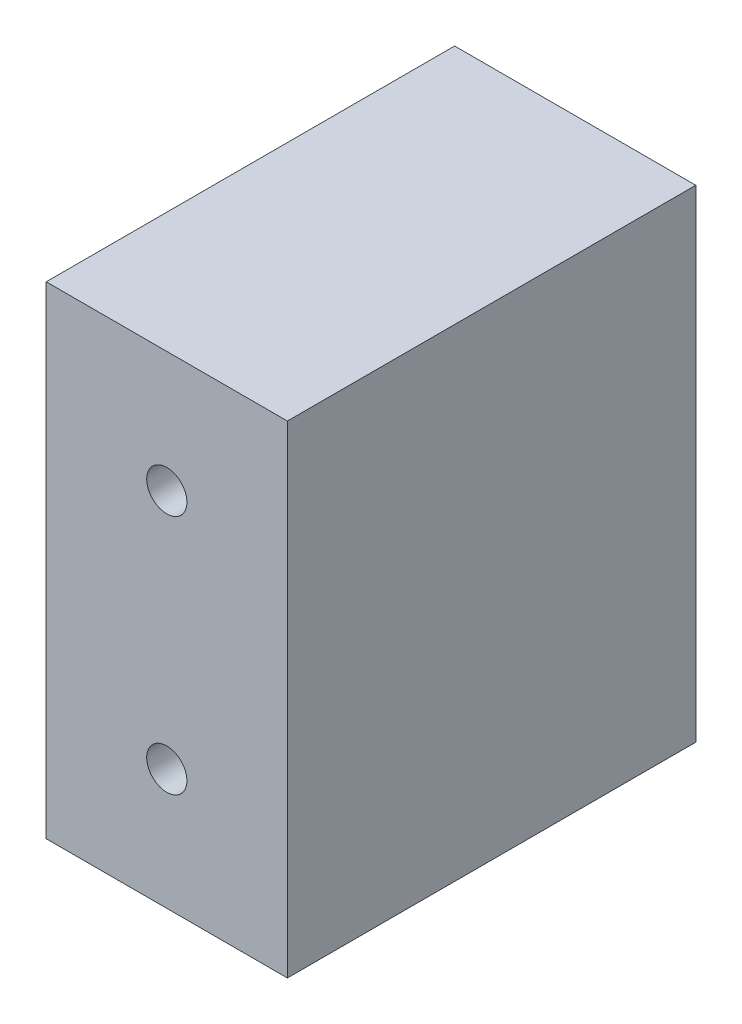
ISO-10303-21;
HEADER;
FILE_DESCRIPTION(('STEP AP214'),'2;1');
FILE_NAME('part.step','',(''),(''),'','','');
FILE_SCHEMA(('AUTOMOTIVE_DESIGN { 1 0 10303 214 1 1 1 1 }'));
ENDSEC;
DATA;
#1=APPLICATION_CONTEXT('core data for automotive mechanical design processes');
#2=APPLICATION_PROTOCOL_DEFINITION('international standard','automotive_design',2000,#1);
#3=PRODUCT_CONTEXT('',#1,'mechanical');
#4=PRODUCT('Part','Part','',(#3));
#5=PRODUCT_RELATED_PRODUCT_CATEGORY('part','',(#4));
#6=PRODUCT_DEFINITION_FORMATION('','',#4);
#7=PRODUCT_DEFINITION_CONTEXT('part definition',#1,'design');
#8=PRODUCT_DEFINITION('design','',#6,#7);
#9=PRODUCT_DEFINITION_SHAPE('','',#8);
#10=(LENGTH_UNIT() NAMED_UNIT(*) SI_UNIT(.MILLI.,.METRE.));
#11=(NAMED_UNIT(*) PLANE_ANGLE_UNIT() SI_UNIT($,.RADIAN.));
#12=(NAMED_UNIT(*) SI_UNIT($,.STERADIAN.) SOLID_ANGLE_UNIT());
#13=UNCERTAINTY_MEASURE_WITH_UNIT(LENGTH_MEASURE(1.E-05),#10,'distance_accuracy_value','');
#14=(GEOMETRIC_REPRESENTATION_CONTEXT(3) GLOBAL_UNCERTAINTY_ASSIGNED_CONTEXT((#13)) GLOBAL_UNIT_ASSIGNED_CONTEXT((#10,
#11,#12)) REPRESENTATION_CONTEXT('',''));
#15=CARTESIAN_POINT('',(0.,0.,0.));
#16=DIRECTION('',(0.,0.,1.));
#17=DIRECTION('',(1.,0.,0.));
#18=AXIS2_PLACEMENT_3D('',#15,#16,#17);
#19=CARTESIAN_POINT('',(0.,0.,25.4));
#20=DIRECTION('',(0.,0.,1.));
#21=DIRECTION('',(1.,0.,0.));
#22=AXIS2_PLACEMENT_3D('',#19,#20,#21);
#23=PLANE('',#22);
#24=CARTESIAN_POINT('',(0.88120104438642,-0.665796344647519,25.4));
#25=DIRECTION('',(0.,0.,1.));
#26=DIRECTION('',(1.,0.,0.));
#27=AXIS2_PLACEMENT_3D('',#24,#25,#26);
#28=CIRCLE('',#27,1.25);
#29=CARTESIAN_POINT('',(2.13120104438642,-0.665796344647519,25.4));
#30=VERTEX_POINT('',#29);
#31=EDGE_CURVE('E100',#30,#30,#28,.T.);
#32=ORIENTED_EDGE('',*,*,#31,.F.);
#33=EDGE_LOOP('',(#32));
#34=FACE_BOUND('',#33,.T.);
#35=DIRECTION('',(0.,-1.,0.));
#36=VECTOR('',#35,1.);
#37=CARTESIAN_POINT('',(-6.61879895561358,6.83420365535248,25.4));
#38=LINE('',#37,#36);
#39=CARTESIAN_POINT('',(-6.61879895561358,6.83420365535248,25.4));
#40=VERTEX_POINT('',#39);
#41=CARTESIAN_POINT('',(-6.61879895561358,-23.1657963446475,25.4));
#42=VERTEX_POINT('',#41);
#43=EDGE_CURVE('E85',#40,#42,#38,.T.);
#44=ORIENTED_EDGE('',*,*,#43,.T.);
#45=DIRECTION('',(1.,0.,0.));
#46=VECTOR('',#45,1.);
#47=CARTESIAN_POINT('',(-6.61879895561358,-23.1657963446475,25.4));
#48=LINE('',#47,#46);
#49=CARTESIAN_POINT('',(8.38120104438642,-23.1657963446475,25.4));
#50=VERTEX_POINT('',#49);
#51=EDGE_CURVE('E80',#42,#50,#48,.T.);
#52=ORIENTED_EDGE('',*,*,#51,.T.);
#53=DIRECTION('',(0.,1.,0.));
#54=VECTOR('',#53,1.);
#55=CARTESIAN_POINT('',(8.38120104438642,6.83420365535248,25.4));
#56=LINE('',#55,#54);
#57=CARTESIAN_POINT('',(8.38120104438642,6.83420365535248,25.4));
#58=VERTEX_POINT('',#57);
#59=EDGE_CURVE('E83',#50,#58,#56,.T.);
#60=ORIENTED_EDGE('',*,*,#59,.T.);
#61=DIRECTION('',(-1.,0.,0.));
#62=VECTOR('',#61,1.);
#63=CARTESIAN_POINT('',(-6.61879895561358,6.83420365535248,25.4));
#64=LINE('',#63,#62);
#65=EDGE_CURVE('E50',#58,#40,#64,.T.);
#66=ORIENTED_EDGE('',*,*,#65,.T.);
#67=EDGE_LOOP('',(#44,#52,#60,#66));
#68=FACE_BOUND('',#67,.T.);
#69=CARTESIAN_POINT('',(0.881201044386421,-15.6657963446475,25.4));
#70=DIRECTION('',(0.,0.,1.));
#71=DIRECTION('',(1.,0.,0.));
#72=AXIS2_PLACEMENT_3D('',#69,#70,#71);
#73=CIRCLE('',#72,1.25);
#74=CARTESIAN_POINT('',(2.13120104438642,-15.6657963446475,25.4));
#75=VERTEX_POINT('',#74);
#76=EDGE_CURVE('E115',#75,#75,#73,.T.);
#77=ORIENTED_EDGE('',*,*,#76,.F.);
#78=EDGE_LOOP('',(#77));
#79=FACE_BOUND('',#78,.T.);
#80=ADVANCED_FACE('F33',(#34,#68,#79),#23,.T.);
#81=CARTESIAN_POINT('',(0.,0.,0.));
#82=DIRECTION('',(0.,0.,1.));
#83=DIRECTION('',(1.,0.,0.));
#84=AXIS2_PLACEMENT_3D('',#81,#82,#83);
#85=PLANE('',#84);
#86=DIRECTION('',(0.,-1.,0.));
#87=VECTOR('',#86,1.);
#88=CARTESIAN_POINT('',(-6.61879895561358,6.83420365535248,0.));
#89=LINE('',#88,#87);
#90=CARTESIAN_POINT('',(-6.61879895561358,6.83420365535248,0.));
#91=VERTEX_POINT('',#90);
#92=CARTESIAN_POINT('',(-6.61879895561358,-23.1657963446475,0.));
#93=VERTEX_POINT('',#92);
#94=EDGE_CURVE('E97',#91,#93,#89,.T.);
#95=ORIENTED_EDGE('',*,*,#94,.F.);
#96=DIRECTION('',(-1.,0.,0.));
#97=VECTOR('',#96,1.);
#98=CARTESIAN_POINT('',(-6.61879895561358,6.83420365535248,0.));
#99=LINE('',#98,#97);
#100=CARTESIAN_POINT('',(8.38120104438642,6.83420365535248,0.));
#101=VERTEX_POINT('',#100);
#102=EDGE_CURVE('E73',#101,#91,#99,.T.);
#103=ORIENTED_EDGE('',*,*,#102,.F.);
#104=DIRECTION('',(0.,1.,0.));
#105=VECTOR('',#104,1.);
#106=CARTESIAN_POINT('',(8.38120104438642,6.83420365535248,0.));
#107=LINE('',#106,#105);
#108=CARTESIAN_POINT('',(8.38120104438642,-23.1657963446475,0.));
#109=VERTEX_POINT('',#108);
#110=EDGE_CURVE('E67',#109,#101,#107,.T.);
#111=ORIENTED_EDGE('',*,*,#110,.F.);
#112=DIRECTION('',(1.,0.,0.));
#113=VECTOR('',#112,1.);
#114=CARTESIAN_POINT('',(-6.61879895561358,-23.1657963446475,0.));
#115=LINE('',#114,#113);
#116=EDGE_CURVE('E89',#93,#109,#115,.T.);
#117=ORIENTED_EDGE('',*,*,#116,.F.);
#118=EDGE_LOOP('',(#95,#103,#111,#117));
#119=FACE_BOUND('',#118,.T.);
#120=CARTESIAN_POINT('',(0.88120104438642,-0.665796344647519,0.));
#121=DIRECTION('',(0.,0.,1.));
#122=DIRECTION('',(1.,0.,0.));
#123=AXIS2_PLACEMENT_3D('',#120,#121,#122);
#124=CIRCLE('',#123,1.25);
#125=CARTESIAN_POINT('',(2.13120104438642,-0.665796344647519,0.));
#126=VERTEX_POINT('',#125);
#127=EDGE_CURVE('E112',#126,#126,#124,.T.);
#128=ORIENTED_EDGE('',*,*,#127,.T.);
#129=EDGE_LOOP('',(#128));
#130=FACE_BOUND('',#129,.T.);
#131=CARTESIAN_POINT('',(0.881201044386421,-15.6657963446475,0.));
#132=DIRECTION('',(0.,0.,1.));
#133=DIRECTION('',(1.,0.,0.));
#134=AXIS2_PLACEMENT_3D('',#131,#132,#133);
#135=CIRCLE('',#134,1.25);
#136=CARTESIAN_POINT('',(2.13120104438642,-15.6657963446475,0.));
#137=VERTEX_POINT('',#136);
#138=EDGE_CURVE('E118',#137,#137,#135,.T.);
#139=ORIENTED_EDGE('',*,*,#138,.T.);
#140=EDGE_LOOP('',(#139));
#141=FACE_BOUND('',#140,.T.);
#142=ADVANCED_FACE('F108',(#119,#130,#141),#85,.F.);
#143=CARTESIAN_POINT('',(-6.61879895561358,6.83420365535248,25.4));
#144=DIRECTION('',(1.,0.,0.));
#145=DIRECTION('',(0.,1.,0.));
#146=AXIS2_PLACEMENT_3D('',#143,#144,#145);
#147=PLANE('',#146);
#148=ORIENTED_EDGE('',*,*,#94,.T.);
#149=DIRECTION('',(0.,0.,-1.));
#150=VECTOR('',#149,1.);
#151=CARTESIAN_POINT('',(-6.61879895561358,-23.1657963446475,25.4));
#152=LINE('',#151,#150);
#153=EDGE_CURVE('E11',#42,#93,#152,.T.);
#154=ORIENTED_EDGE('',*,*,#153,.F.);
#155=ORIENTED_EDGE('',*,*,#43,.F.);
#156=DIRECTION('',(0.,0.,-1.));
#157=VECTOR('',#156,1.);
#158=CARTESIAN_POINT('',(-6.61879895561358,6.83420365535248,25.4));
#159=LINE('',#158,#157);
#160=EDGE_CURVE('E93',#40,#91,#159,.T.);
#161=ORIENTED_EDGE('',*,*,#160,.T.);
#162=EDGE_LOOP('',(#148,#154,#155,#161));
#163=FACE_BOUND('',#162,.T.);
#164=ADVANCED_FACE('F35',(#163),#147,.F.);
#165=CARTESIAN_POINT('',(-6.61879895561358,-23.1657963446475,25.4));
#166=DIRECTION('',(0.,1.,0.));
#167=DIRECTION('',(0.,0.,1.));
#168=AXIS2_PLACEMENT_3D('',#165,#166,#167);
#169=PLANE('',#168);
#170=ORIENTED_EDGE('',*,*,#116,.T.);
#171=DIRECTION('',(0.,0.,-1.));
#172=VECTOR('',#171,1.);
#173=CARTESIAN_POINT('',(8.38120104438642,-23.1657963446475,25.4));
#174=LINE('',#173,#172);
#175=EDGE_CURVE('E42',#50,#109,#174,.T.);
#176=ORIENTED_EDGE('',*,*,#175,.F.);
#177=ORIENTED_EDGE('',*,*,#51,.F.);
#178=ORIENTED_EDGE('',*,*,#153,.T.);
#179=EDGE_LOOP('',(#170,#176,#177,#178));
#180=FACE_BOUND('',#179,.T.);
#181=ADVANCED_FACE('F88',(#180),#169,.F.);
#182=CARTESIAN_POINT('',(8.38120104438642,6.83420365535248,25.4));
#183=DIRECTION('',(-1.,0.,0.));
#184=DIRECTION('',(0.,-1.,0.));
#185=AXIS2_PLACEMENT_3D('',#182,#183,#184);
#186=PLANE('',#185);
#187=ORIENTED_EDGE('',*,*,#110,.T.);
#188=DIRECTION('',(0.,0.,-1.));
#189=VECTOR('',#188,1.);
#190=CARTESIAN_POINT('',(8.38120104438642,6.83420365535248,25.4));
#191=LINE('',#190,#189);
#192=EDGE_CURVE('E90',#58,#101,#191,.T.);
#193=ORIENTED_EDGE('',*,*,#192,.F.);
#194=ORIENTED_EDGE('',*,*,#59,.F.);
#195=ORIENTED_EDGE('',*,*,#175,.T.);
#196=EDGE_LOOP('',(#187,#193,#194,#195));
#197=FACE_BOUND('',#196,.T.);
#198=ADVANCED_FACE('F91',(#197),#186,.F.);
#199=CARTESIAN_POINT('',(-6.61879895561358,6.83420365535248,25.4));
#200=DIRECTION('',(0.,-1.,0.));
#201=DIRECTION('',(0.,0.,-1.));
#202=AXIS2_PLACEMENT_3D('',#199,#200,#201);
#203=PLANE('',#202);
#204=ORIENTED_EDGE('',*,*,#102,.T.);
#205=ORIENTED_EDGE('',*,*,#160,.F.);
#206=ORIENTED_EDGE('',*,*,#65,.F.);
#207=ORIENTED_EDGE('',*,*,#192,.T.);
#208=EDGE_LOOP('',(#204,#205,#206,#207));
#209=FACE_BOUND('',#208,.T.);
#210=ADVANCED_FACE('F105',(#209),#203,.F.);
#211=CARTESIAN_POINT('',(0.88120104438642,-0.665796344647519,25.4));
#212=DIRECTION('',(0.,0.,-1.));
#213=DIRECTION('',(-1.,0.,0.));
#214=AXIS2_PLACEMENT_3D('',#211,#212,#213);
#215=CYLINDRICAL_SURFACE('',#214,1.25);
#216=ORIENTED_EDGE('',*,*,#31,.T.);
#217=EDGE_LOOP('',(#216));
#218=FACE_BOUND('',#217,.T.);
#219=ORIENTED_EDGE('',*,*,#127,.F.);
#220=EDGE_LOOP('',(#219));
#221=FACE_BOUND('',#220,.T.);
#222=ADVANCED_FACE('F135',(#218,#221),#215,.F.);
#223=CARTESIAN_POINT('',(0.881201044386421,-15.6657963446475,25.4));
#224=DIRECTION('',(0.,0.,-1.));
#225=DIRECTION('',(-1.,0.,0.));
#226=AXIS2_PLACEMENT_3D('',#223,#224,#225);
#227=CYLINDRICAL_SURFACE('',#226,1.25);
#228=ORIENTED_EDGE('',*,*,#76,.T.);
#229=EDGE_LOOP('',(#228));
#230=FACE_BOUND('',#229,.T.);
#231=ORIENTED_EDGE('',*,*,#138,.F.);
#232=EDGE_LOOP('',(#231));
#233=FACE_BOUND('',#232,.T.);
#234=ADVANCED_FACE('F124',(#230,#233),#227,.F.);
#235=CLOSED_SHELL('',(#80,#142,#164,#181,#198,#210,#222,#234));
#236=MANIFOLD_SOLID_BREP('B2',#235);
#237=ADVANCED_BREP_SHAPE_REPRESENTATION('',(#18,#236),#14);
#238=SHAPE_DEFINITION_REPRESENTATION(#9,#237);
ENDSEC;
END-ISO-10303-21;
